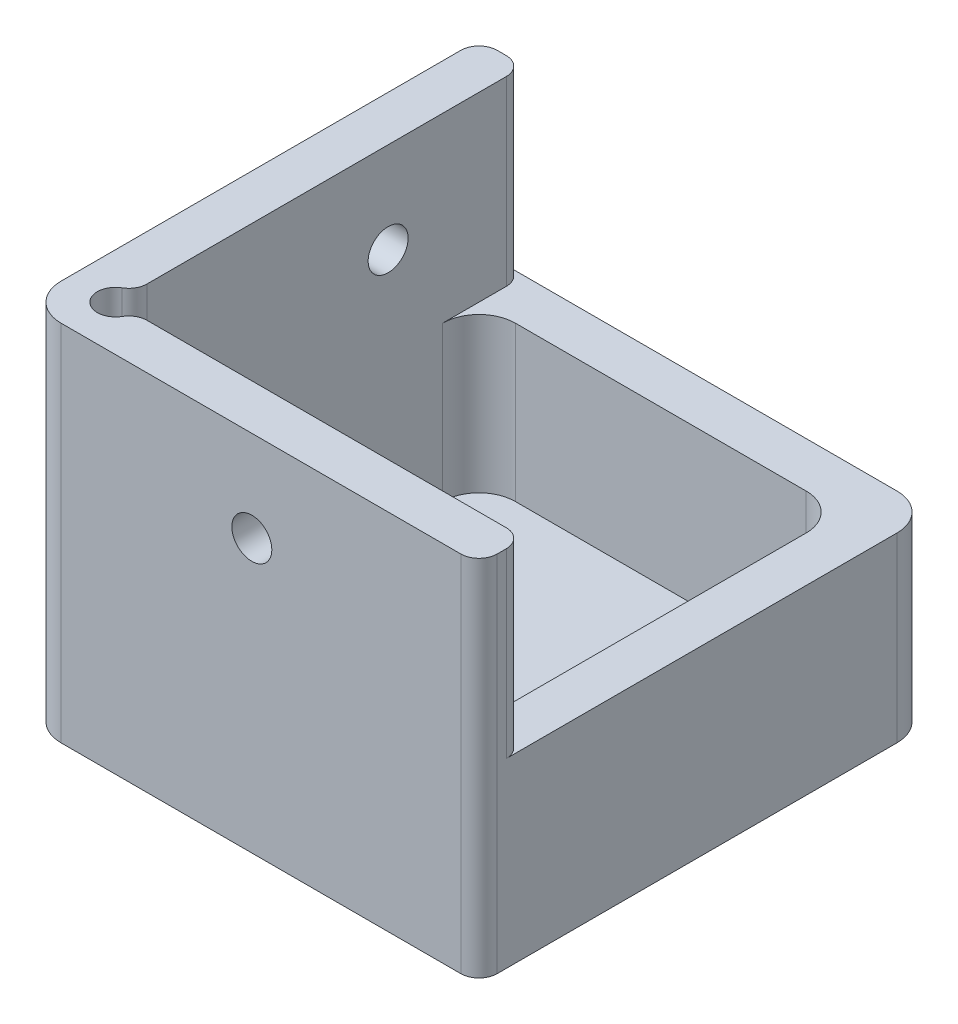
ISO-10303-21;
HEADER;
FILE_DESCRIPTION(('STEP AP214'),'2;1');
FILE_NAME('part.step','',(''),(''),'','','');
FILE_SCHEMA(('AUTOMOTIVE_DESIGN { 1 0 10303 214 1 1 1 1 }'));
ENDSEC;
DATA;
#1=APPLICATION_CONTEXT('core data for automotive mechanical design processes');
#2=APPLICATION_PROTOCOL_DEFINITION('international standard','automotive_design',2000,#1);
#3=PRODUCT_CONTEXT('',#1,'mechanical');
#4=PRODUCT('Part','Part','',(#3));
#5=PRODUCT_RELATED_PRODUCT_CATEGORY('part','',(#4));
#6=PRODUCT_DEFINITION_FORMATION('','',#4);
#7=PRODUCT_DEFINITION_CONTEXT('part definition',#1,'design');
#8=PRODUCT_DEFINITION('design','',#6,#7);
#9=PRODUCT_DEFINITION_SHAPE('','',#8);
#10=(LENGTH_UNIT() NAMED_UNIT(*) SI_UNIT(.MILLI.,.METRE.));
#11=(NAMED_UNIT(*) PLANE_ANGLE_UNIT() SI_UNIT($,.RADIAN.));
#12=(NAMED_UNIT(*) SI_UNIT($,.STERADIAN.) SOLID_ANGLE_UNIT());
#13=UNCERTAINTY_MEASURE_WITH_UNIT(LENGTH_MEASURE(1.E-05),#10,'distance_accuracy_value','');
#14=(GEOMETRIC_REPRESENTATION_CONTEXT(3) GLOBAL_UNCERTAINTY_ASSIGNED_CONTEXT((#13)) GLOBAL_UNIT_ASSIGNED_CONTEXT((#10,
#11,#12)) REPRESENTATION_CONTEXT('',''));
#15=CARTESIAN_POINT('',(0.,0.,0.));
#16=DIRECTION('',(0.,0.,1.));
#17=DIRECTION('',(1.,0.,0.));
#18=AXIS2_PLACEMENT_3D('',#15,#16,#17);
#19=CARTESIAN_POINT('',(0.,20.,-50.));
#20=DIRECTION('',(1.,0.,0.));
#21=DIRECTION('',(0.,0.,-1.));
#22=AXIS2_PLACEMENT_3D('',#19,#20,#21);
#23=PLANE('',#22);
#24=CARTESIAN_POINT('',(0.,10.,-35.));
#25=DIRECTION('',(-1.,0.,0.));
#26=DIRECTION('',(0.,0.,1.));
#27=AXIS2_PLACEMENT_3D('',#24,#25,#26);
#28=CIRCLE('',#27,2.2);
#29=CARTESIAN_POINT('',(0.,10.,-32.8));
#30=VERTEX_POINT('',#29);
#31=EDGE_CURVE('E252',#30,#30,#28,.T.);
#32=ORIENTED_EDGE('',*,*,#31,.F.);
#33=EDGE_LOOP('',(#32));
#34=FACE_BOUND('',#33,.T.);
#35=DIRECTION('',(0.,0.,1.));
#36=VECTOR('',#35,1.);
#37=CARTESIAN_POINT('',(0.,20.,-50.));
#38=LINE('',#37,#36);
#39=CARTESIAN_POINT('',(0.,20.,-48.));
#40=VERTEX_POINT('',#39);
#41=CARTESIAN_POINT('',(0.,20.,-4.));
#42=VERTEX_POINT('',#41);
#43=EDGE_CURVE('E259',#40,#42,#38,.T.);
#44=ORIENTED_EDGE('',*,*,#43,.F.);
#45=DIRECTION('',(0.,-1.,0.));
#46=VECTOR('',#45,1.);
#47=CARTESIAN_POINT('',(0.,20.,-48.));
#48=LINE('',#47,#46);
#49=CARTESIAN_POINT('',(0.,-20.,-48.));
#50=VERTEX_POINT('',#49);
#51=EDGE_CURVE('E349',#40,#50,#48,.T.);
#52=ORIENTED_EDGE('',*,*,#51,.T.);
#53=DIRECTION('',(0.,0.,-1.));
#54=VECTOR('',#53,1.);
#55=CARTESIAN_POINT('',(0.,-20.,0.));
#56=LINE('',#55,#54);
#57=CARTESIAN_POINT('',(0.,-20.,-4.));
#58=VERTEX_POINT('',#57);
#59=EDGE_CURVE('E233',#58,#50,#56,.T.);
#60=ORIENTED_EDGE('',*,*,#59,.F.);
#61=DIRECTION('',(0.,-1.,0.));
#62=VECTOR('',#61,1.);
#63=CARTESIAN_POINT('',(0.,20.,-4.));
#64=LINE('',#63,#62);
#65=EDGE_CURVE('E303',#58,#42,#64,.F.);
#66=ORIENTED_EDGE('',*,*,#65,.T.);
#67=EDGE_LOOP('',(#44,#52,#60,#66));
#68=FACE_BOUND('',#67,.T.);
#69=ADVANCED_FACE('F39',(#34,#68),#23,.F.);
#70=CARTESIAN_POINT('',(0.,20.,0.));
#71=DIRECTION('',(0.,0.,-1.));
#72=DIRECTION('',(-1.,0.,0.));
#73=AXIS2_PLACEMENT_3D('',#70,#71,#72);
#74=PLANE('',#73);
#75=CARTESIAN_POINT('',(25.,10.,0.));
#76=DIRECTION('',(0.,0.,1.));
#77=DIRECTION('',(1.,0.,0.));
#78=AXIS2_PLACEMENT_3D('',#75,#76,#77);
#79=CIRCLE('',#78,2.2);
#80=CARTESIAN_POINT('',(27.2,10.,0.));
#81=VERTEX_POINT('',#80);
#82=EDGE_CURVE('E243',#81,#81,#79,.T.);
#83=ORIENTED_EDGE('',*,*,#82,.F.);
#84=EDGE_LOOP('',(#83));
#85=FACE_BOUND('',#84,.T.);
#86=DIRECTION('',(-1.,0.,0.));
#87=VECTOR('',#86,1.);
#88=CARTESIAN_POINT('',(0.,-20.,0.));
#89=LINE('',#88,#87);
#90=CARTESIAN_POINT('',(48.,-20.,0.));
#91=VERTEX_POINT('',#90);
#92=CARTESIAN_POINT('',(4.,-20.,0.));
#93=VERTEX_POINT('',#92);
#94=EDGE_CURVE('E241',#91,#93,#89,.T.);
#95=ORIENTED_EDGE('',*,*,#94,.F.);
#96=DIRECTION('',(0.,-1.,0.));
#97=VECTOR('',#96,1.);
#98=CARTESIAN_POINT('',(48.,20.,0.));
#99=LINE('',#98,#97);
#100=CARTESIAN_POINT('',(48.,20.,0.));
#101=VERTEX_POINT('',#100);
#102=EDGE_CURVE('E359',#91,#101,#99,.F.);
#103=ORIENTED_EDGE('',*,*,#102,.T.);
#104=DIRECTION('',(1.,0.,0.));
#105=VECTOR('',#104,1.);
#106=CARTESIAN_POINT('',(0.,20.,0.));
#107=LINE('',#106,#105);
#108=CARTESIAN_POINT('',(4.,20.,0.));
#109=VERTEX_POINT('',#108);
#110=EDGE_CURVE('E261',#109,#101,#107,.T.);
#111=ORIENTED_EDGE('',*,*,#110,.F.);
#112=DIRECTION('',(0.,-1.,0.));
#113=VECTOR('',#112,1.);
#114=CARTESIAN_POINT('',(4.,20.,0.));
#115=LINE('',#114,#113);
#116=EDGE_CURVE('E296',#109,#93,#115,.T.);
#117=ORIENTED_EDGE('',*,*,#116,.T.);
#118=EDGE_LOOP('',(#95,#103,#111,#117));
#119=FACE_BOUND('',#118,.T.);
#120=ADVANCED_FACE('F400',(#85,#119),#74,.F.);
#121=CARTESIAN_POINT('',(50.,20.,0.));
#122=DIRECTION('',(-1.,0.,0.));
#123=DIRECTION('',(0.,0.,1.));
#124=AXIS2_PLACEMENT_3D('',#121,#122,#123);
#125=PLANE('',#124);
#126=DIRECTION('',(0.,0.,-1.));
#127=VECTOR('',#126,1.);
#128=CARTESIAN_POINT('',(50.,20.,0.));
#129=LINE('',#128,#127);
#130=CARTESIAN_POINT('',(50.,20.,-2.));
#131=VERTEX_POINT('',#130);
#132=CARTESIAN_POINT('',(50.,20.,-3.));
#133=VERTEX_POINT('',#132);
#134=EDGE_CURVE('E265',#131,#133,#129,.T.);
#135=ORIENTED_EDGE('',*,*,#134,.F.);
#136=DIRECTION('',(0.,-1.,0.));
#137=VECTOR('',#136,1.);
#138=CARTESIAN_POINT('',(50.,20.,-2.));
#139=LINE('',#138,#137);
#140=CARTESIAN_POINT('',(50.,-20.,-2.));
#141=VERTEX_POINT('',#140);
#142=EDGE_CURVE('E357',#131,#141,#139,.T.);
#143=ORIENTED_EDGE('',*,*,#142,.T.);
#144=DIRECTION('',(0.,0.,1.));
#145=VECTOR('',#144,1.);
#146=CARTESIAN_POINT('',(50.,-20.,0.));
#147=LINE('',#146,#145);
#148=CARTESIAN_POINT('',(50.,-20.,-46.));
#149=VERTEX_POINT('',#148);
#150=EDGE_CURVE('E238',#149,#141,#147,.T.);
#151=ORIENTED_EDGE('',*,*,#150,.F.);
#152=DIRECTION('',(0.,1.,0.));
#153=VECTOR('',#152,1.);
#154=CARTESIAN_POINT('',(50.,20.,-46.));
#155=LINE('',#154,#153);
#156=CARTESIAN_POINT('',(50.,0.,-46.));
#157=VERTEX_POINT('',#156);
#158=EDGE_CURVE('E308',#149,#157,#155,.T.);
#159=ORIENTED_EDGE('',*,*,#158,.T.);
#160=DIRECTION('',(0.,0.,1.));
#161=VECTOR('',#160,1.);
#162=CARTESIAN_POINT('',(50.,0.,0.));
#163=LINE('',#162,#161);
#164=CARTESIAN_POINT('',(50.,0.,-3.));
#165=VERTEX_POINT('',#164);
#166=EDGE_CURVE('E54',#157,#165,#163,.T.);
#167=ORIENTED_EDGE('',*,*,#166,.T.);
#168=DIRECTION('',(0.,-1.,0.));
#169=VECTOR('',#168,1.);
#170=CARTESIAN_POINT('',(50.,20.,-3.));
#171=LINE('',#170,#169);
#172=EDGE_CURVE('E355',#165,#133,#171,.F.);
#173=ORIENTED_EDGE('',*,*,#172,.T.);
#174=EDGE_LOOP('',(#135,#143,#151,#159,#167,#173));
#175=FACE_BOUND('',#174,.T.);
#176=ADVANCED_FACE('F404',(#175),#125,.F.);
#177=CARTESIAN_POINT('',(50.,20.,-5.));
#178=DIRECTION('',(0.,0.,1.));
#179=DIRECTION('',(1.,0.,0.));
#180=AXIS2_PLACEMENT_3D('',#177,#178,#179);
#181=PLANE('',#180);
#182=CARTESIAN_POINT('',(25.,10.,-5.));
#183=DIRECTION('',(0.,0.,1.));
#184=DIRECTION('',(1.,0.,0.));
#185=AXIS2_PLACEMENT_3D('',#182,#183,#184);
#186=CIRCLE('',#185,2.2);
#187=CARTESIAN_POINT('',(27.2,10.,-5.));
#188=VERTEX_POINT('',#187);
#189=EDGE_CURVE('E249',#188,#188,#186,.F.);
#190=ORIENTED_EDGE('',*,*,#189,.F.);
#191=EDGE_LOOP('',(#190));
#192=FACE_BOUND('',#191,.T.);
#193=DIRECTION('',(1.,0.,0.));
#194=VECTOR('',#193,1.);
#195=CARTESIAN_POINT('',(5.,-17.,-5.));
#196=LINE('',#195,#194);
#197=CARTESIAN_POINT('',(8.46410161513776,-17.,-5.));
#198=VERTEX_POINT('',#197);
#199=CARTESIAN_POINT('',(41.,-17.,-5.));
#200=VERTEX_POINT('',#199);
#201=EDGE_CURVE('E216',#198,#200,#196,.T.);
#202=ORIENTED_EDGE('',*,*,#201,.F.);
#203=DIRECTION('',(0.,1.,0.));
#204=VECTOR('',#203,1.);
#205=CARTESIAN_POINT('',(8.46410161513776,20.,-5.));
#206=LINE('',#205,#204);
#207=CARTESIAN_POINT('',(8.46410161513777,20.,-5.));
#208=VERTEX_POINT('',#207);
#209=EDGE_CURVE('E341',#198,#208,#206,.T.);
#210=ORIENTED_EDGE('',*,*,#209,.T.);
#211=DIRECTION('',(-1.,0.,0.));
#212=VECTOR('',#211,1.);
#213=CARTESIAN_POINT('',(50.,20.,-5.));
#214=LINE('',#213,#212);
#215=CARTESIAN_POINT('',(48.,20.,-5.));
#216=VERTEX_POINT('',#215);
#217=EDGE_CURVE('E268',#216,#208,#214,.T.);
#218=ORIENTED_EDGE('',*,*,#217,.F.);
#219=DIRECTION('',(0.,-1.,0.));
#220=VECTOR('',#219,1.);
#221=CARTESIAN_POINT('',(48.,20.,-5.));
#222=LINE('',#221,#220);
#223=CARTESIAN_POINT('',(48.,0.,-5.));
#224=VERTEX_POINT('',#223);
#225=EDGE_CURVE('E338',#216,#224,#222,.T.);
#226=ORIENTED_EDGE('',*,*,#225,.T.);
#227=DIRECTION('',(-1.,0.,0.));
#228=VECTOR('',#227,1.);
#229=CARTESIAN_POINT('',(50.,0.,-5.));
#230=LINE('',#229,#228);
#231=CARTESIAN_POINT('',(41.,0.,-5.));
#232=VERTEX_POINT('',#231);
#233=EDGE_CURVE('E258',#224,#232,#230,.T.);
#234=ORIENTED_EDGE('',*,*,#233,.T.);
#235=DIRECTION('',(0.,1.,0.));
#236=VECTOR('',#235,1.);
#237=CARTESIAN_POINT('',(41.,-17.,-5.));
#238=LINE('',#237,#236);
#239=EDGE_CURVE('E290',#232,#200,#238,.F.);
#240=ORIENTED_EDGE('',*,*,#239,.T.);
#241=EDGE_LOOP('',(#202,#210,#218,#226,#234,#240));
#242=FACE_BOUND('',#241,.T.);
#243=ADVANCED_FACE('F412',(#192,#242),#181,.F.);
#244=CARTESIAN_POINT('',(5.,20.,-5.));
#245=DIRECTION('',(-1.,0.,0.));
#246=DIRECTION('',(0.,0.,1.));
#247=AXIS2_PLACEMENT_3D('',#244,#245,#246);
#248=PLANE('',#247);
#249=CARTESIAN_POINT('',(5.,10.,-35.));
#250=DIRECTION('',(-1.,0.,0.));
#251=DIRECTION('',(0.,0.,1.));
#252=AXIS2_PLACEMENT_3D('',#249,#250,#251);
#253=CIRCLE('',#252,2.2);
#254=CARTESIAN_POINT('',(5.,10.,-32.8));
#255=VERTEX_POINT('',#254);
#256=EDGE_CURVE('E255',#255,#255,#253,.F.);
#257=ORIENTED_EDGE('',*,*,#256,.F.);
#258=EDGE_LOOP('',(#257));
#259=FACE_BOUND('',#258,.T.);
#260=DIRECTION('',(0.,0.,-1.));
#261=VECTOR('',#260,1.);
#262=CARTESIAN_POINT('',(5.,20.,-5.));
#263=LINE('',#262,#261);
#264=CARTESIAN_POINT('',(5.,20.,-8.46410161513776));
#265=VERTEX_POINT('',#264);
#266=CARTESIAN_POINT('',(5.,20.,-48.));
#267=VERTEX_POINT('',#266);
#268=EDGE_CURVE('E271',#265,#267,#263,.T.);
#269=ORIENTED_EDGE('',*,*,#268,.F.);
#270=DIRECTION('',(0.,1.,0.));
#271=VECTOR('',#270,1.);
#272=CARTESIAN_POINT('',(5.,20.,-8.46410161513776));
#273=LINE('',#272,#271);
#274=CARTESIAN_POINT('',(5.,-17.,-8.46410161513776));
#275=VERTEX_POINT('',#274);
#276=EDGE_CURVE('E319',#265,#275,#273,.F.);
#277=ORIENTED_EDGE('',*,*,#276,.T.);
#278=DIRECTION('',(0.,0.,1.));
#279=VECTOR('',#278,1.);
#280=CARTESIAN_POINT('',(5.,-17.,-5.));
#281=LINE('',#280,#279);
#282=CARTESIAN_POINT('',(5.,-17.,-41.));
#283=VERTEX_POINT('',#282);
#284=EDGE_CURVE('E226',#283,#275,#281,.T.);
#285=ORIENTED_EDGE('',*,*,#284,.F.);
#286=DIRECTION('',(0.,1.,0.));
#287=VECTOR('',#286,1.);
#288=CARTESIAN_POINT('',(5.,0.,-41.));
#289=LINE('',#288,#287);
#290=CARTESIAN_POINT('',(5.,0.,-41.));
#291=VERTEX_POINT('',#290);
#292=EDGE_CURVE('E293',#283,#291,#289,.T.);
#293=ORIENTED_EDGE('',*,*,#292,.T.);
#294=DIRECTION('',(0.,0.,-1.));
#295=VECTOR('',#294,1.);
#296=CARTESIAN_POINT('',(5.,0.,-5.));
#297=LINE('',#296,#295);
#298=CARTESIAN_POINT('',(5.,0.,-48.));
#299=VERTEX_POINT('',#298);
#300=EDGE_CURVE('E262',#291,#299,#297,.T.);
#301=ORIENTED_EDGE('',*,*,#300,.T.);
#302=DIRECTION('',(0.,-1.,0.));
#303=VECTOR('',#302,1.);
#304=CARTESIAN_POINT('',(5.,20.,-48.));
#305=LINE('',#304,#303);
#306=EDGE_CURVE('E317',#299,#267,#305,.F.);
#307=ORIENTED_EDGE('',*,*,#306,.T.);
#308=EDGE_LOOP('',(#269,#277,#285,#293,#301,#307));
#309=FACE_BOUND('',#308,.T.);
#310=ADVANCED_FACE('F370',(#259,#309),#248,.F.);
#311=CARTESIAN_POINT('',(5.,20.,-50.));
#312=DIRECTION('',(0.,0.,1.));
#313=DIRECTION('',(1.,0.,0.));
#314=AXIS2_PLACEMENT_3D('',#311,#312,#313);
#315=PLANE('',#314);
#316=DIRECTION('',(-1.,0.,0.));
#317=VECTOR('',#316,1.);
#318=CARTESIAN_POINT('',(5.,20.,-50.));
#319=LINE('',#318,#317);
#320=CARTESIAN_POINT('',(3.,20.,-50.));
#321=VERTEX_POINT('',#320);
#322=CARTESIAN_POINT('',(2.,20.,-50.));
#323=VERTEX_POINT('',#322);
#324=EDGE_CURVE('E274',#321,#323,#319,.T.);
#325=ORIENTED_EDGE('',*,*,#324,.F.);
#326=DIRECTION('',(0.,-1.,0.));
#327=VECTOR('',#326,1.);
#328=CARTESIAN_POINT('',(3.,20.,-50.));
#329=LINE('',#328,#327);
#330=CARTESIAN_POINT('',(3.,0.,-50.));
#331=VERTEX_POINT('',#330);
#332=EDGE_CURVE('E346',#321,#331,#329,.T.);
#333=ORIENTED_EDGE('',*,*,#332,.T.);
#334=DIRECTION('',(1.,0.,0.));
#335=VECTOR('',#334,1.);
#336=CARTESIAN_POINT('',(0.,0.,-50.));
#337=LINE('',#336,#335);
#338=CARTESIAN_POINT('',(46.,0.,-50.));
#339=VERTEX_POINT('',#338);
#340=EDGE_CURVE('E229',#331,#339,#337,.T.);
#341=ORIENTED_EDGE('',*,*,#340,.T.);
#342=DIRECTION('',(0.,1.,0.));
#343=VECTOR('',#342,1.);
#344=CARTESIAN_POINT('',(46.,20.,-50.));
#345=LINE('',#344,#343);
#346=CARTESIAN_POINT('',(46.,-20.,-50.));
#347=VERTEX_POINT('',#346);
#348=EDGE_CURVE('E200',#339,#347,#345,.F.);
#349=ORIENTED_EDGE('',*,*,#348,.T.);
#350=DIRECTION('',(1.,0.,0.));
#351=VECTOR('',#350,1.);
#352=CARTESIAN_POINT('',(0.,-20.,-50.));
#353=LINE('',#352,#351);
#354=CARTESIAN_POINT('',(2.,-20.,-50.));
#355=VERTEX_POINT('',#354);
#356=EDGE_CURVE('E236',#355,#347,#353,.T.);
#357=ORIENTED_EDGE('',*,*,#356,.F.);
#358=DIRECTION('',(0.,-1.,0.));
#359=VECTOR('',#358,1.);
#360=CARTESIAN_POINT('',(2.,20.,-50.));
#361=LINE('',#360,#359);
#362=EDGE_CURVE('E344',#355,#323,#361,.F.);
#363=ORIENTED_EDGE('',*,*,#362,.T.);
#364=EDGE_LOOP('',(#325,#333,#341,#349,#357,#363));
#365=FACE_BOUND('',#364,.T.);
#366=ADVANCED_FACE('F381',(#365),#315,.F.);
#367=CARTESIAN_POINT('',(0.,20.,0.));
#368=DIRECTION('',(0.,1.,0.));
#369=DIRECTION('',(0.,0.,1.));
#370=AXIS2_PLACEMENT_3D('',#367,#368,#369);
#371=PLANE('',#370);
#372=CARTESIAN_POINT('',(5.,20.,-5.));
#373=DIRECTION('',(0.,1.,0.));
#374=DIRECTION('',(0.,0.,1.));
#375=AXIS2_PLACEMENT_3D('',#372,#373,#374);
#376=CIRCLE('',#375,2.);
#377=CARTESIAN_POINT('',(4.,20.,-6.73205080756888));
#378=VERTEX_POINT('',#377);
#379=CARTESIAN_POINT('',(6.73205080756888,20.,-4.));
#380=VERTEX_POINT('',#379);
#381=EDGE_CURVE('E420',#378,#380,#376,.T.);
#382=ORIENTED_EDGE('',*,*,#381,.F.);
#383=CARTESIAN_POINT('',(3.,20.,-8.46410161513776));
#384=DIRECTION('',(0.,1.,0.));
#385=DIRECTION('',(0.,0.,1.));
#386=AXIS2_PLACEMENT_3D('',#383,#384,#385);
#387=CIRCLE('',#386,2.);
#388=EDGE_CURVE('E336',#378,#265,#387,.T.);
#389=ORIENTED_EDGE('',*,*,#388,.T.);
#390=ORIENTED_EDGE('',*,*,#268,.T.);
#391=CARTESIAN_POINT('',(3.,20.,-48.));
#392=DIRECTION('',(0.,1.,0.));
#393=DIRECTION('',(0.,0.,1.));
#394=AXIS2_PLACEMENT_3D('',#391,#392,#393);
#395=CIRCLE('',#394,2.);
#396=EDGE_CURVE('E332',#267,#321,#395,.T.);
#397=ORIENTED_EDGE('',*,*,#396,.T.);
#398=ORIENTED_EDGE('',*,*,#324,.T.);
#399=CARTESIAN_POINT('',(2.,20.,-48.));
#400=DIRECTION('',(0.,1.,0.));
#401=DIRECTION('',(0.,0.,1.));
#402=AXIS2_PLACEMENT_3D('',#399,#400,#401);
#403=CIRCLE('',#402,2.);
#404=EDGE_CURVE('E330',#323,#40,#403,.T.);
#405=ORIENTED_EDGE('',*,*,#404,.T.);
#406=ORIENTED_EDGE('',*,*,#43,.T.);
#407=CARTESIAN_POINT('',(4.,20.,-4.));
#408=DIRECTION('',(0.,1.,0.));
#409=DIRECTION('',(0.,0.,1.));
#410=AXIS2_PLACEMENT_3D('',#407,#408,#409);
#411=CIRCLE('',#410,4.);
#412=EDGE_CURVE('E306',#42,#109,#411,.T.);
#413=ORIENTED_EDGE('',*,*,#412,.T.);
#414=ORIENTED_EDGE('',*,*,#110,.T.);
#415=CARTESIAN_POINT('',(48.,20.,-2.));
#416=DIRECTION('',(0.,1.,0.));
#417=DIRECTION('',(0.,0.,1.));
#418=AXIS2_PLACEMENT_3D('',#415,#416,#417);
#419=CIRCLE('',#418,2.);
#420=EDGE_CURVE('E328',#101,#131,#419,.T.);
#421=ORIENTED_EDGE('',*,*,#420,.T.);
#422=ORIENTED_EDGE('',*,*,#134,.T.);
#423=CARTESIAN_POINT('',(48.,20.,-3.));
#424=DIRECTION('',(0.,1.,0.));
#425=DIRECTION('',(0.,0.,1.));
#426=AXIS2_PLACEMENT_3D('',#423,#424,#425);
#427=CIRCLE('',#426,2.);
#428=EDGE_CURVE('E326',#133,#216,#427,.T.);
#429=ORIENTED_EDGE('',*,*,#428,.T.);
#430=ORIENTED_EDGE('',*,*,#217,.T.);
#431=CARTESIAN_POINT('',(8.46410161513776,20.,-3.));
#432=DIRECTION('',(0.,1.,0.));
#433=DIRECTION('',(0.,0.,1.));
#434=AXIS2_PLACEMENT_3D('',#431,#432,#433);
#435=CIRCLE('',#434,2.);
#436=EDGE_CURVE('E334',#208,#380,#435,.T.);
#437=ORIENTED_EDGE('',*,*,#436,.T.);
#438=EDGE_LOOP('',(#382,#389,#390,#397,#398,#405,#406,#413,#414,#421,#422,#429,#430,#437));
#439=FACE_BOUND('',#438,.T.);
#440=ADVANCED_FACE('F378',(#439),#371,.T.);
#441=CARTESIAN_POINT('',(50.001,10.,-35.));
#442=DIRECTION('',(-1.,0.,0.));
#443=DIRECTION('',(0.,0.,1.));
#444=AXIS2_PLACEMENT_3D('',#441,#442,#443);
#445=CYLINDRICAL_SURFACE('',#444,2.2);
#446=ORIENTED_EDGE('',*,*,#31,.T.);
#447=EDGE_LOOP('',(#446));
#448=FACE_BOUND('',#447,.T.);
#449=ORIENTED_EDGE('',*,*,#256,.T.);
#450=EDGE_LOOP('',(#449));
#451=FACE_BOUND('',#450,.T.);
#452=ADVANCED_FACE('F482',(#448,#451),#445,.F.);
#453=CARTESIAN_POINT('',(25.,10.,-50.001));
#454=DIRECTION('',(0.,0.,1.));
#455=DIRECTION('',(1.,0.,0.));
#456=AXIS2_PLACEMENT_3D('',#453,#454,#455);
#457=CYLINDRICAL_SURFACE('',#456,2.2);
#458=ORIENTED_EDGE('',*,*,#82,.T.);
#459=EDGE_LOOP('',(#458));
#460=FACE_BOUND('',#459,.T.);
#461=ORIENTED_EDGE('',*,*,#189,.T.);
#462=EDGE_LOOP('',(#461));
#463=FACE_BOUND('',#462,.T.);
#464=ADVANCED_FACE('F476',(#460,#463),#457,.F.);
#465=CARTESIAN_POINT('',(0.,-20.,0.));
#466=DIRECTION('',(0.,-1.,0.));
#467=DIRECTION('',(0.,0.,-1.));
#468=AXIS2_PLACEMENT_3D('',#465,#466,#467);
#469=PLANE('',#468);
#470=ORIENTED_EDGE('',*,*,#59,.T.);
#471=CARTESIAN_POINT('',(2.,-20.,-48.));
#472=DIRECTION('',(0.,-1.,0.));
#473=DIRECTION('',(0.,0.,-1.));
#474=AXIS2_PLACEMENT_3D('',#471,#472,#473);
#475=CIRCLE('',#474,2.);
#476=EDGE_CURVE('E353',#50,#355,#475,.T.);
#477=ORIENTED_EDGE('',*,*,#476,.T.);
#478=ORIENTED_EDGE('',*,*,#356,.T.);
#479=CARTESIAN_POINT('',(46.,-20.,-46.));
#480=DIRECTION('',(0.,-1.,0.));
#481=DIRECTION('',(0.,0.,-1.));
#482=AXIS2_PLACEMENT_3D('',#479,#480,#481);
#483=CIRCLE('',#482,4.);
#484=EDGE_CURVE('E299',#347,#149,#483,.T.);
#485=ORIENTED_EDGE('',*,*,#484,.T.);
#486=ORIENTED_EDGE('',*,*,#150,.T.);
#487=CARTESIAN_POINT('',(48.,-20.,-2.));
#488=DIRECTION('',(0.,-1.,0.));
#489=DIRECTION('',(0.,0.,-1.));
#490=AXIS2_PLACEMENT_3D('',#487,#488,#489);
#491=CIRCLE('',#490,2.);
#492=EDGE_CURVE('E61',#141,#91,#491,.T.);
#493=ORIENTED_EDGE('',*,*,#492,.T.);
#494=ORIENTED_EDGE('',*,*,#94,.T.);
#495=CARTESIAN_POINT('',(4.,-20.,-4.));
#496=DIRECTION('',(0.,-1.,0.));
#497=DIRECTION('',(0.,0.,-1.));
#498=AXIS2_PLACEMENT_3D('',#495,#496,#497);
#499=CIRCLE('',#498,4.);
#500=EDGE_CURVE('E301',#93,#58,#499,.T.);
#501=ORIENTED_EDGE('',*,*,#500,.T.);
#502=EDGE_LOOP('',(#470,#477,#478,#485,#486,#493,#494,#501));
#503=FACE_BOUND('',#502,.T.);
#504=ADVANCED_FACE('F473',(#503),#469,.T.);
#505=CARTESIAN_POINT('',(0.,0.,0.));
#506=DIRECTION('',(0.,-1.,0.));
#507=DIRECTION('',(0.,0.,-1.));
#508=AXIS2_PLACEMENT_3D('',#505,#506,#507);
#509=PLANE('',#508);
#510=ORIENTED_EDGE('',*,*,#166,.F.);
#511=CARTESIAN_POINT('',(46.,0.,-46.));
#512=DIRECTION('',(0.,-1.,0.));
#513=DIRECTION('',(0.,0.,-1.));
#514=AXIS2_PLACEMENT_3D('',#511,#512,#513);
#515=CIRCLE('',#514,4.);
#516=EDGE_CURVE('E310',#157,#339,#515,.F.);
#517=ORIENTED_EDGE('',*,*,#516,.T.);
#518=ORIENTED_EDGE('',*,*,#340,.F.);
#519=CARTESIAN_POINT('',(3.,0.,-48.));
#520=DIRECTION('',(0.,-1.,0.));
#521=DIRECTION('',(0.,0.,-1.));
#522=AXIS2_PLACEMENT_3D('',#519,#520,#521);
#523=CIRCLE('',#522,2.);
#524=EDGE_CURVE('E47',#331,#299,#523,.T.);
#525=ORIENTED_EDGE('',*,*,#524,.T.);
#526=ORIENTED_EDGE('',*,*,#300,.F.);
#527=CARTESIAN_POINT('',(9.,0.,-41.));
#528=DIRECTION('',(0.,-1.,0.));
#529=DIRECTION('',(0.,0.,-1.));
#530=AXIS2_PLACEMENT_3D('',#527,#528,#529);
#531=CIRCLE('',#530,4.);
#532=CARTESIAN_POINT('',(9.,0.,-45.));
#533=VERTEX_POINT('',#532);
#534=EDGE_CURVE('E215',#291,#533,#531,.T.);
#535=ORIENTED_EDGE('',*,*,#534,.T.);
#536=DIRECTION('',(-1.,0.,0.));
#537=VECTOR('',#536,1.);
#538=CARTESIAN_POINT('',(5.,0.,-45.));
#539=LINE('',#538,#537);
#540=CARTESIAN_POINT('',(41.,0.,-45.));
#541=VERTEX_POINT('',#540);
#542=EDGE_CURVE('E206',#541,#533,#539,.T.);
#543=ORIENTED_EDGE('',*,*,#542,.F.);
#544=CARTESIAN_POINT('',(41.,0.,-41.));
#545=DIRECTION('',(0.,-1.,0.));
#546=DIRECTION('',(0.,0.,-1.));
#547=AXIS2_PLACEMENT_3D('',#544,#545,#546);
#548=CIRCLE('',#547,4.);
#549=CARTESIAN_POINT('',(45.,0.,-41.));
#550=VERTEX_POINT('',#549);
#551=EDGE_CURVE('E189',#541,#550,#548,.T.);
#552=ORIENTED_EDGE('',*,*,#551,.T.);
#553=DIRECTION('',(0.,0.,-1.));
#554=VECTOR('',#553,1.);
#555=CARTESIAN_POINT('',(45.,0.,-5.));
#556=LINE('',#555,#554);
#557=CARTESIAN_POINT('',(45.,0.,-9.));
#558=VERTEX_POINT('',#557);
#559=EDGE_CURVE('E217',#558,#550,#556,.T.);
#560=ORIENTED_EDGE('',*,*,#559,.F.);
#561=CARTESIAN_POINT('',(41.,0.,-9.));
#562=DIRECTION('',(0.,-1.,0.));
#563=DIRECTION('',(0.,0.,-1.));
#564=AXIS2_PLACEMENT_3D('',#561,#562,#563);
#565=CIRCLE('',#564,4.);
#566=EDGE_CURVE('E199',#558,#232,#565,.T.);
#567=ORIENTED_EDGE('',*,*,#566,.T.);
#568=ORIENTED_EDGE('',*,*,#233,.F.);
#569=CARTESIAN_POINT('',(48.,0.,-3.));
#570=DIRECTION('',(0.,-1.,0.));
#571=DIRECTION('',(0.,0.,-1.));
#572=AXIS2_PLACEMENT_3D('',#569,#570,#571);
#573=CIRCLE('',#572,2.);
#574=EDGE_CURVE('E12',#224,#165,#573,.T.);
#575=ORIENTED_EDGE('',*,*,#574,.T.);
#576=EDGE_LOOP('',(#510,#517,#518,#525,#526,#535,#543,#552,#560,#567,#568,#575));
#577=FACE_BOUND('',#576,.T.);
#578=ADVANCED_FACE('F213',(#577),#509,.F.);
#579=CARTESIAN_POINT('',(0.,-17.,0.));
#580=DIRECTION('',(0.,-1.,0.));
#581=DIRECTION('',(0.,0.,-1.));
#582=AXIS2_PLACEMENT_3D('',#579,#580,#581);
#583=PLANE('',#582);
#584=DIRECTION('',(0.,0.,-1.));
#585=VECTOR('',#584,1.);
#586=CARTESIAN_POINT('',(45.,-17.,-5.));
#587=LINE('',#586,#585);
#588=CARTESIAN_POINT('',(45.,-17.,-9.));
#589=VERTEX_POINT('',#588);
#590=CARTESIAN_POINT('',(45.,-17.,-41.));
#591=VERTEX_POINT('',#590);
#592=EDGE_CURVE('E219',#589,#591,#587,.T.);
#593=ORIENTED_EDGE('',*,*,#592,.T.);
#594=CARTESIAN_POINT('',(41.,-17.,-41.));
#595=DIRECTION('',(0.,-1.,0.));
#596=DIRECTION('',(0.,0.,-1.));
#597=AXIS2_PLACEMENT_3D('',#594,#595,#596);
#598=CIRCLE('',#597,4.);
#599=CARTESIAN_POINT('',(41.,-17.,-45.));
#600=VERTEX_POINT('',#599);
#601=EDGE_CURVE('E288',#591,#600,#598,.F.);
#602=ORIENTED_EDGE('',*,*,#601,.T.);
#603=DIRECTION('',(-1.,0.,0.));
#604=VECTOR('',#603,1.);
#605=CARTESIAN_POINT('',(5.,-17.,-45.));
#606=LINE('',#605,#604);
#607=CARTESIAN_POINT('',(9.,-17.,-45.));
#608=VERTEX_POINT('',#607);
#609=EDGE_CURVE('E209',#600,#608,#606,.T.);
#610=ORIENTED_EDGE('',*,*,#609,.T.);
#611=CARTESIAN_POINT('',(9.,-17.,-41.));
#612=DIRECTION('',(0.,-1.,0.));
#613=DIRECTION('',(0.,0.,-1.));
#614=AXIS2_PLACEMENT_3D('',#611,#612,#613);
#615=CIRCLE('',#614,4.);
#616=EDGE_CURVE('E284',#608,#283,#615,.F.);
#617=ORIENTED_EDGE('',*,*,#616,.T.);
#618=ORIENTED_EDGE('',*,*,#284,.T.);
#619=CARTESIAN_POINT('',(3.,-17.,-8.46410161513776));
#620=DIRECTION('',(0.,-1.,0.));
#621=DIRECTION('',(0.,0.,-1.));
#622=AXIS2_PLACEMENT_3D('',#619,#620,#621);
#623=CIRCLE('',#622,2.);
#624=CARTESIAN_POINT('',(4.,-17.,-6.73205080756888));
#625=VERTEX_POINT('',#624);
#626=EDGE_CURVE('E361',#275,#625,#623,.T.);
#627=ORIENTED_EDGE('',*,*,#626,.T.);
#628=CARTESIAN_POINT('',(5.,-17.,-5.));
#629=DIRECTION('',(0.,-1.,0.));
#630=DIRECTION('',(0.,0.,-1.));
#631=AXIS2_PLACEMENT_3D('',#628,#629,#630);
#632=CIRCLE('',#631,2.);
#633=CARTESIAN_POINT('',(6.73205080756888,-17.,-4.));
#634=VERTEX_POINT('',#633);
#635=EDGE_CURVE('E221',#625,#634,#632,.F.);
#636=ORIENTED_EDGE('',*,*,#635,.T.);
#637=CARTESIAN_POINT('',(8.46410161513776,-17.,-3.));
#638=DIRECTION('',(0.,-1.,0.));
#639=DIRECTION('',(0.,0.,-1.));
#640=AXIS2_PLACEMENT_3D('',#637,#638,#639);
#641=CIRCLE('',#640,2.);
#642=EDGE_CURVE('E363',#634,#198,#641,.T.);
#643=ORIENTED_EDGE('',*,*,#642,.T.);
#644=ORIENTED_EDGE('',*,*,#201,.T.);
#645=CARTESIAN_POINT('',(41.,-17.,-9.));
#646=DIRECTION('',(0.,-1.,0.));
#647=DIRECTION('',(0.,0.,-1.));
#648=AXIS2_PLACEMENT_3D('',#645,#646,#647);
#649=CIRCLE('',#648,4.);
#650=EDGE_CURVE('E286',#200,#589,#649,.F.);
#651=ORIENTED_EDGE('',*,*,#650,.T.);
#652=EDGE_LOOP('',(#593,#602,#610,#617,#618,#627,#636,#643,#644,#651));
#653=FACE_BOUND('',#652,.T.);
#654=ADVANCED_FACE('F428',(#653),#583,.F.);
#655=CARTESIAN_POINT('',(45.,-76.5685424949238,-5.));
#656=DIRECTION('',(1.,0.,0.));
#657=DIRECTION('',(0.,0.,-1.));
#658=AXIS2_PLACEMENT_3D('',#655,#656,#657);
#659=PLANE('',#658);
#660=ORIENTED_EDGE('',*,*,#559,.T.);
#661=DIRECTION('',(0.,1.,0.));
#662=VECTOR('',#661,1.);
#663=CARTESIAN_POINT('',(45.,-17.,-41.));
#664=LINE('',#663,#662);
#665=EDGE_CURVE('E194',#550,#591,#664,.F.);
#666=ORIENTED_EDGE('',*,*,#665,.T.);
#667=ORIENTED_EDGE('',*,*,#592,.F.);
#668=DIRECTION('',(0.,1.,0.));
#669=VECTOR('',#668,1.);
#670=CARTESIAN_POINT('',(45.,0.,-9.));
#671=LINE('',#670,#669);
#672=EDGE_CURVE('E210',#589,#558,#671,.T.);
#673=ORIENTED_EDGE('',*,*,#672,.T.);
#674=EDGE_LOOP('',(#660,#666,#667,#673));
#675=FACE_BOUND('',#674,.T.);
#676=ADVANCED_FACE('F465',(#675),#659,.F.);
#677=CARTESIAN_POINT('',(5.,-76.5685424949238,-45.));
#678=DIRECTION('',(0.,0.,-1.));
#679=DIRECTION('',(-1.,0.,0.));
#680=AXIS2_PLACEMENT_3D('',#677,#678,#679);
#681=PLANE('',#680);
#682=ORIENTED_EDGE('',*,*,#609,.F.);
#683=DIRECTION('',(0.,1.,0.));
#684=VECTOR('',#683,1.);
#685=CARTESIAN_POINT('',(41.,0.,-45.));
#686=LINE('',#685,#684);
#687=EDGE_CURVE('E193',#600,#541,#686,.T.);
#688=ORIENTED_EDGE('',*,*,#687,.T.);
#689=ORIENTED_EDGE('',*,*,#542,.T.);
#690=DIRECTION('',(0.,1.,0.));
#691=VECTOR('',#690,1.);
#692=CARTESIAN_POINT('',(9.,-17.,-45.));
#693=LINE('',#692,#691);
#694=EDGE_CURVE('E211',#533,#608,#693,.F.);
#695=ORIENTED_EDGE('',*,*,#694,.T.);
#696=EDGE_LOOP('',(#682,#688,#689,#695));
#697=FACE_BOUND('',#696,.T.);
#698=ADVANCED_FACE('F205',(#697),#681,.F.);
#699=CARTESIAN_POINT('',(5.,-22.6568542494924,-5.));
#700=DIRECTION('',(0.,1.,0.));
#701=DIRECTION('',(0.,0.,1.));
#702=AXIS2_PLACEMENT_3D('',#699,#700,#701);
#703=CYLINDRICAL_SURFACE('',#702,2.);
#704=ORIENTED_EDGE('',*,*,#635,.F.);
#705=DIRECTION('',(0.,1.,0.));
#706=VECTOR('',#705,1.);
#707=CARTESIAN_POINT('',(4.,-22.6568542494924,-6.73205080756888));
#708=LINE('',#707,#706);
#709=EDGE_CURVE('E324',#625,#378,#708,.T.);
#710=ORIENTED_EDGE('',*,*,#709,.T.);
#711=ORIENTED_EDGE('',*,*,#381,.T.);
#712=DIRECTION('',(0.,1.,0.));
#713=VECTOR('',#712,1.);
#714=CARTESIAN_POINT('',(6.73205080756888,-22.6568542494924,-4.));
#715=LINE('',#714,#713);
#716=EDGE_CURVE('E322',#380,#634,#715,.F.);
#717=ORIENTED_EDGE('',*,*,#716,.T.);
#718=EDGE_LOOP('',(#704,#710,#711,#717));
#719=FACE_BOUND('',#718,.T.);
#720=ADVANCED_FACE('F424',(#719),#703,.F.);
#721=CARTESIAN_POINT('',(41.,-76.5685424949238,-41.));
#722=DIRECTION('',(0.,-1.,0.));
#723=DIRECTION('',(0.,0.,-1.));
#724=AXIS2_PLACEMENT_3D('',#721,#722,#723);
#725=CYLINDRICAL_SURFACE('',#724,4.);
#726=ORIENTED_EDGE('',*,*,#601,.F.);
#727=ORIENTED_EDGE('',*,*,#665,.F.);
#728=ORIENTED_EDGE('',*,*,#551,.F.);
#729=ORIENTED_EDGE('',*,*,#687,.F.);
#730=EDGE_LOOP('',(#726,#727,#728,#729));
#731=FACE_BOUND('',#730,.T.);
#732=ADVANCED_FACE('F192',(#731),#725,.F.);
#733=CARTESIAN_POINT('',(41.,-76.5685424949238,-9.));
#734=DIRECTION('',(0.,-1.,0.));
#735=DIRECTION('',(0.,0.,-1.));
#736=AXIS2_PLACEMENT_3D('',#733,#734,#735);
#737=CYLINDRICAL_SURFACE('',#736,4.);
#738=ORIENTED_EDGE('',*,*,#650,.F.);
#739=ORIENTED_EDGE('',*,*,#239,.F.);
#740=ORIENTED_EDGE('',*,*,#566,.F.);
#741=ORIENTED_EDGE('',*,*,#672,.F.);
#742=EDGE_LOOP('',(#738,#739,#740,#741));
#743=FACE_BOUND('',#742,.T.);
#744=ADVANCED_FACE('F436',(#743),#737,.F.);
#745=CARTESIAN_POINT('',(9.,20.,-41.));
#746=DIRECTION('',(0.,-1.,0.));
#747=DIRECTION('',(0.,0.,-1.));
#748=AXIS2_PLACEMENT_3D('',#745,#746,#747);
#749=CYLINDRICAL_SURFACE('',#748,4.);
#750=ORIENTED_EDGE('',*,*,#616,.F.);
#751=ORIENTED_EDGE('',*,*,#694,.F.);
#752=ORIENTED_EDGE('',*,*,#534,.F.);
#753=ORIENTED_EDGE('',*,*,#292,.F.);
#754=EDGE_LOOP('',(#750,#751,#752,#753));
#755=FACE_BOUND('',#754,.T.);
#756=ADVANCED_FACE('F434',(#755),#749,.F.);
#757=CARTESIAN_POINT('',(4.,20.,-4.));
#758=DIRECTION('',(0.,-1.,0.));
#759=DIRECTION('',(0.,0.,-1.));
#760=AXIS2_PLACEMENT_3D('',#757,#758,#759);
#761=CYLINDRICAL_SURFACE('',#760,4.);
#762=ORIENTED_EDGE('',*,*,#412,.F.);
#763=ORIENTED_EDGE('',*,*,#65,.F.);
#764=ORIENTED_EDGE('',*,*,#500,.F.);
#765=ORIENTED_EDGE('',*,*,#116,.F.);
#766=EDGE_LOOP('',(#762,#763,#764,#765));
#767=FACE_BOUND('',#766,.T.);
#768=ADVANCED_FACE('F395',(#767),#761,.T.);
#769=CARTESIAN_POINT('',(46.,20.,-46.));
#770=DIRECTION('',(0.,1.,0.));
#771=DIRECTION('',(0.,0.,1.));
#772=AXIS2_PLACEMENT_3D('',#769,#770,#771);
#773=CYLINDRICAL_SURFACE('',#772,4.);
#774=ORIENTED_EDGE('',*,*,#484,.F.);
#775=ORIENTED_EDGE('',*,*,#348,.F.);
#776=ORIENTED_EDGE('',*,*,#516,.F.);
#777=ORIENTED_EDGE('',*,*,#158,.F.);
#778=EDGE_LOOP('',(#774,#775,#776,#777));
#779=FACE_BOUND('',#778,.T.);
#780=ADVANCED_FACE('F442',(#779),#773,.T.);
#781=CARTESIAN_POINT('',(3.,-22.6568542494924,-8.46410161513776));
#782=DIRECTION('',(0.,1.,0.));
#783=DIRECTION('',(0.,0.,1.));
#784=AXIS2_PLACEMENT_3D('',#781,#782,#783);
#785=CYLINDRICAL_SURFACE('',#784,2.);
#786=ORIENTED_EDGE('',*,*,#388,.F.);
#787=ORIENTED_EDGE('',*,*,#709,.F.);
#788=ORIENTED_EDGE('',*,*,#626,.F.);
#789=ORIENTED_EDGE('',*,*,#276,.F.);
#790=EDGE_LOOP('',(#786,#787,#788,#789));
#791=FACE_BOUND('',#790,.T.);
#792=ADVANCED_FACE('F430',(#791),#785,.T.);
#793=CARTESIAN_POINT('',(8.46410161513776,-22.6568542494924,-3.));
#794=DIRECTION('',(0.,1.,0.));
#795=DIRECTION('',(0.,0.,1.));
#796=AXIS2_PLACEMENT_3D('',#793,#794,#795);
#797=CYLINDRICAL_SURFACE('',#796,2.);
#798=ORIENTED_EDGE('',*,*,#642,.F.);
#799=ORIENTED_EDGE('',*,*,#716,.F.);
#800=ORIENTED_EDGE('',*,*,#436,.F.);
#801=ORIENTED_EDGE('',*,*,#209,.F.);
#802=EDGE_LOOP('',(#798,#799,#800,#801));
#803=FACE_BOUND('',#802,.T.);
#804=ADVANCED_FACE('F417',(#803),#797,.T.);
#805=CARTESIAN_POINT('',(3.,20.,-48.));
#806=DIRECTION('',(0.,-1.,0.));
#807=DIRECTION('',(0.,0.,-1.));
#808=AXIS2_PLACEMENT_3D('',#805,#806,#807);
#809=CYLINDRICAL_SURFACE('',#808,2.);
#810=ORIENTED_EDGE('',*,*,#396,.F.);
#811=ORIENTED_EDGE('',*,*,#306,.F.);
#812=ORIENTED_EDGE('',*,*,#524,.F.);
#813=ORIENTED_EDGE('',*,*,#332,.F.);
#814=EDGE_LOOP('',(#810,#811,#812,#813));
#815=FACE_BOUND('',#814,.T.);
#816=ADVANCED_FACE('F374',(#815),#809,.T.);
#817=CARTESIAN_POINT('',(2.,20.,-48.));
#818=DIRECTION('',(0.,-1.,0.));
#819=DIRECTION('',(0.,0.,-1.));
#820=AXIS2_PLACEMENT_3D('',#817,#818,#819);
#821=CYLINDRICAL_SURFACE('',#820,2.);
#822=ORIENTED_EDGE('',*,*,#404,.F.);
#823=ORIENTED_EDGE('',*,*,#362,.F.);
#824=ORIENTED_EDGE('',*,*,#476,.F.);
#825=ORIENTED_EDGE('',*,*,#51,.F.);
#826=EDGE_LOOP('',(#822,#823,#824,#825));
#827=FACE_BOUND('',#826,.T.);
#828=ADVANCED_FACE('F385',(#827),#821,.T.);
#829=CARTESIAN_POINT('',(48.,20.,-2.));
#830=DIRECTION('',(0.,-1.,0.));
#831=DIRECTION('',(0.,0.,-1.));
#832=AXIS2_PLACEMENT_3D('',#829,#830,#831);
#833=CYLINDRICAL_SURFACE('',#832,2.);
#834=ORIENTED_EDGE('',*,*,#420,.F.);
#835=ORIENTED_EDGE('',*,*,#102,.F.);
#836=ORIENTED_EDGE('',*,*,#492,.F.);
#837=ORIENTED_EDGE('',*,*,#142,.F.);
#838=EDGE_LOOP('',(#834,#835,#836,#837));
#839=FACE_BOUND('',#838,.T.);
#840=ADVANCED_FACE('F401',(#839),#833,.T.);
#841=CARTESIAN_POINT('',(48.,20.,-3.));
#842=DIRECTION('',(0.,-1.,0.));
#843=DIRECTION('',(0.,0.,-1.));
#844=AXIS2_PLACEMENT_3D('',#841,#842,#843);
#845=CYLINDRICAL_SURFACE('',#844,2.);
#846=ORIENTED_EDGE('',*,*,#428,.F.);
#847=ORIENTED_EDGE('',*,*,#172,.F.);
#848=ORIENTED_EDGE('',*,*,#574,.F.);
#849=ORIENTED_EDGE('',*,*,#225,.F.);
#850=EDGE_LOOP('',(#846,#847,#848,#849));
#851=FACE_BOUND('',#850,.T.);
#852=ADVANCED_FACE('F41',(#851),#845,.T.);
#853=CLOSED_SHELL('',(#69,#120,#176,#243,#310,#366,#440,#452,#464,#504,#578,#654,#676,#698,#720,
#732,#744,#756,#768,#780,#792,#804,#816,#828,#840,#852));
#854=MANIFOLD_SOLID_BREP('B2',#853);
#855=ADVANCED_BREP_SHAPE_REPRESENTATION('',(#18,#854),#14);
#856=SHAPE_DEFINITION_REPRESENTATION(#9,#855);
ENDSEC;
END-ISO-10303-21;
